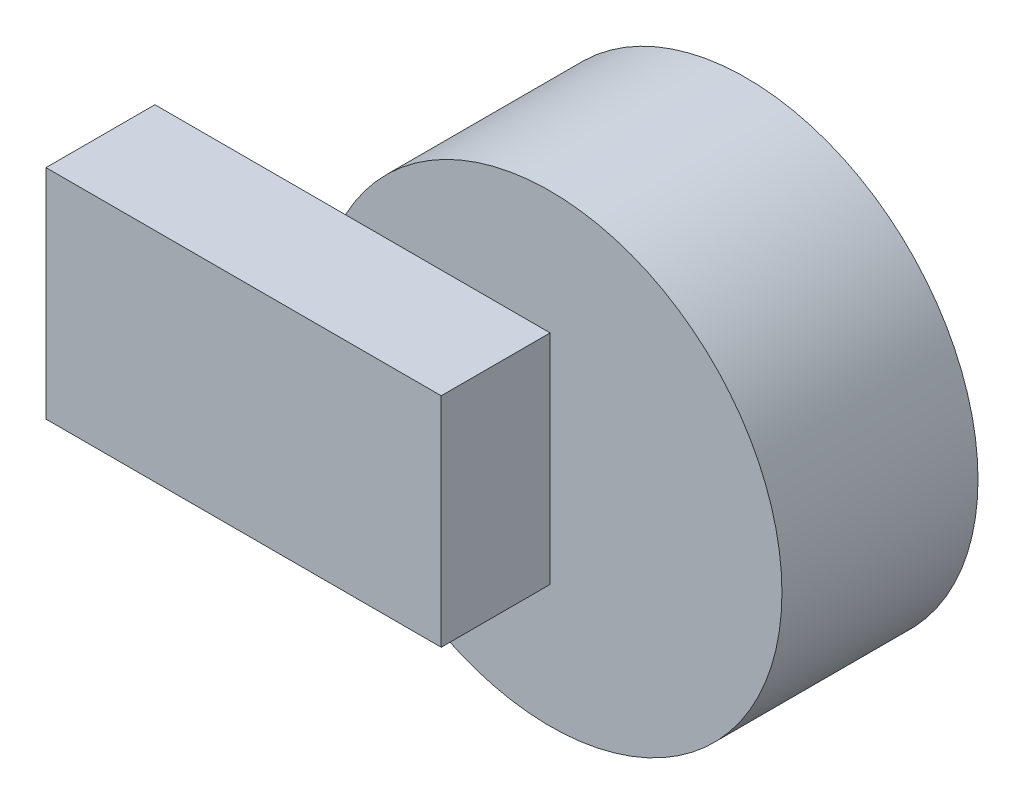
ISO-10303-21;
HEADER;
FILE_DESCRIPTION(('STEP AP214'),'2;1');
FILE_NAME('part.step','',(''),(''),'','','');
FILE_SCHEMA(('AUTOMOTIVE_DESIGN { 1 0 10303 214 1 1 1 1 }'));
ENDSEC;
DATA;
#1=APPLICATION_CONTEXT('core data for automotive mechanical design processes');
#2=APPLICATION_PROTOCOL_DEFINITION('international standard','automotive_design',2000,#1);
#3=PRODUCT_CONTEXT('',#1,'mechanical');
#4=PRODUCT('Part','Part','',(#3));
#5=PRODUCT_RELATED_PRODUCT_CATEGORY('part','',(#4));
#6=PRODUCT_DEFINITION_FORMATION('','',#4);
#7=PRODUCT_DEFINITION_CONTEXT('part definition',#1,'design');
#8=PRODUCT_DEFINITION('design','',#6,#7);
#9=PRODUCT_DEFINITION_SHAPE('','',#8);
#10=(LENGTH_UNIT() NAMED_UNIT(*) SI_UNIT(.MILLI.,.METRE.));
#11=(NAMED_UNIT(*) PLANE_ANGLE_UNIT() SI_UNIT($,.RADIAN.));
#12=(NAMED_UNIT(*) SI_UNIT($,.STERADIAN.) SOLID_ANGLE_UNIT());
#13=UNCERTAINTY_MEASURE_WITH_UNIT(LENGTH_MEASURE(1.E-05),#10,'distance_accuracy_value','');
#14=(GEOMETRIC_REPRESENTATION_CONTEXT(3) GLOBAL_UNCERTAINTY_ASSIGNED_CONTEXT((#13)) GLOBAL_UNIT_ASSIGNED_CONTEXT((#10,
#11,#12)) REPRESENTATION_CONTEXT('',''));
#15=CARTESIAN_POINT('',(0.,0.,0.));
#16=DIRECTION('',(0.,0.,1.));
#17=DIRECTION('',(1.,0.,0.));
#18=AXIS2_PLACEMENT_3D('',#15,#16,#17);
#19=CARTESIAN_POINT('',(0.,0.,36.));
#20=DIRECTION('',(0.,0.,-1.));
#21=DIRECTION('',(-1.,0.,0.));
#22=AXIS2_PLACEMENT_3D('',#19,#20,#21);
#23=CYLINDRICAL_SURFACE('',#22,42.57);
#24=CARTESIAN_POINT('',(0.,0.,36.));
#25=DIRECTION('',(0.,0.,1.));
#26=DIRECTION('',(1.,0.,0.));
#27=AXIS2_PLACEMENT_3D('',#24,#25,#26);
#28=CIRCLE('',#27,42.57);
#29=CARTESIAN_POINT('',(-37.5793147888569,20.,36.));
#30=VERTEX_POINT('',#29);
#31=CARTESIAN_POINT('',(-37.5793147888569,-20.,36.));
#32=VERTEX_POINT('',#31);
#33=EDGE_CURVE('E48',#30,#32,#28,.T.);
#34=ORIENTED_EDGE('',*,*,#33,.F.);
#35=EDGE_CURVE('E119',#32,#30,#28,.T.);
#36=ORIENTED_EDGE('',*,*,#35,.F.);
#37=EDGE_LOOP('',(#34,#36));
#38=FACE_BOUND('',#37,.T.);
#39=CARTESIAN_POINT('',(0.,0.,0.));
#40=DIRECTION('',(0.,0.,1.));
#41=DIRECTION('',(1.,0.,0.));
#42=AXIS2_PLACEMENT_3D('',#39,#40,#41);
#43=CIRCLE('',#42,42.57);
#44=CARTESIAN_POINT('',(42.57,0.,0.));
#45=VERTEX_POINT('',#44);
#46=EDGE_CURVE('E42',#45,#45,#43,.T.);
#47=ORIENTED_EDGE('',*,*,#46,.T.);
#48=EDGE_LOOP('',(#47));
#49=FACE_BOUND('',#48,.T.);
#50=ADVANCED_FACE('F39',(#38,#49),#23,.T.);
#51=CARTESIAN_POINT('',(0.,0.,36.));
#52=DIRECTION('',(0.,0.,1.));
#53=DIRECTION('',(1.,0.,0.));
#54=AXIS2_PLACEMENT_3D('',#51,#52,#53);
#55=PLANE('',#54);
#56=DIRECTION('',(-1.,0.,0.));
#57=VECTOR('',#56,1.);
#58=CARTESIAN_POINT('',(0.,20.,36.));
#59=LINE('',#58,#57);
#60=CARTESIAN_POINT('',(0.,20.,36.));
#61=VERTEX_POINT('',#60);
#62=EDGE_CURVE('E57',#61,#30,#59,.T.);
#63=ORIENTED_EDGE('',*,*,#62,.F.);
#64=DIRECTION('',(0.,-1.,0.));
#65=VECTOR('',#64,1.);
#66=CARTESIAN_POINT('',(0.,0.,36.));
#67=LINE('',#66,#65);
#68=CARTESIAN_POINT('',(0.,-20.,36.));
#69=VERTEX_POINT('',#68);
#70=EDGE_CURVE('E136',#61,#69,#67,.T.);
#71=ORIENTED_EDGE('',*,*,#70,.T.);
#72=DIRECTION('',(1.,0.,0.));
#73=VECTOR('',#72,1.);
#74=CARTESIAN_POINT('',(0.,-20.,36.));
#75=LINE('',#74,#73);
#76=EDGE_CURVE('E11',#32,#69,#75,.T.);
#77=ORIENTED_EDGE('',*,*,#76,.F.);
#78=ORIENTED_EDGE('',*,*,#35,.T.);
#79=EDGE_LOOP('',(#63,#71,#77,#78));
#80=FACE_BOUND('',#79,.T.);
#81=ADVANCED_FACE('F129',(#80),#55,.T.);
#82=CARTESIAN_POINT('',(0.,0.,0.));
#83=DIRECTION('',(0.,0.,1.));
#84=DIRECTION('',(1.,0.,0.));
#85=AXIS2_PLACEMENT_3D('',#82,#83,#84);
#86=PLANE('',#85);
#87=ORIENTED_EDGE('',*,*,#46,.F.);
#88=EDGE_LOOP('',(#87));
#89=FACE_BOUND('',#88,.T.);
#90=ADVANCED_FACE('F168',(#89),#86,.F.);
#91=CARTESIAN_POINT('',(0.,0.,36.));
#92=DIRECTION('',(0.,0.,1.));
#93=DIRECTION('',(1.,0.,0.));
#94=AXIS2_PLACEMENT_3D('',#91,#92,#93);
#95=PLANE('',#94);
#96=CARTESIAN_POINT('',(-72.57,20.,36.));
#97=VERTEX_POINT('',#96);
#98=EDGE_CURVE('E132',#30,#97,#59,.T.);
#99=ORIENTED_EDGE('',*,*,#98,.F.);
#100=ORIENTED_EDGE('',*,*,#33,.T.);
#101=CARTESIAN_POINT('',(-72.57,-20.,36.));
#102=VERTEX_POINT('',#101);
#103=EDGE_CURVE('E50',#102,#32,#75,.T.);
#104=ORIENTED_EDGE('',*,*,#103,.F.);
#105=DIRECTION('',(0.,-1.,0.));
#106=VECTOR('',#105,1.);
#107=CARTESIAN_POINT('',(-72.57,0.,36.));
#108=LINE('',#107,#106);
#109=EDGE_CURVE('E113',#97,#102,#108,.T.);
#110=ORIENTED_EDGE('',*,*,#109,.F.);
#111=EDGE_LOOP('',(#99,#100,#104,#110));
#112=FACE_BOUND('',#111,.T.);
#113=ADVANCED_FACE('F133',(#112),#95,.F.);
#114=CARTESIAN_POINT('',(-72.57,0.,56.));
#115=DIRECTION('',(1.,0.,0.));
#116=DIRECTION('',(0.,0.,-1.));
#117=AXIS2_PLACEMENT_3D('',#114,#115,#116);
#118=PLANE('',#117);
#119=ORIENTED_EDGE('',*,*,#109,.T.);
#120=DIRECTION('',(0.,0.,-1.));
#121=VECTOR('',#120,1.);
#122=CARTESIAN_POINT('',(-72.57,-20.,56.));
#123=LINE('',#122,#121);
#124=CARTESIAN_POINT('',(-72.57,-20.,56.));
#125=VERTEX_POINT('',#124);
#126=EDGE_CURVE('E91',#125,#102,#123,.T.);
#127=ORIENTED_EDGE('',*,*,#126,.F.);
#128=DIRECTION('',(0.,-1.,0.));
#129=VECTOR('',#128,1.);
#130=CARTESIAN_POINT('',(-72.57,0.,56.));
#131=LINE('',#130,#129);
#132=CARTESIAN_POINT('',(-72.57,20.,56.));
#133=VERTEX_POINT('',#132);
#134=EDGE_CURVE('E100',#133,#125,#131,.T.);
#135=ORIENTED_EDGE('',*,*,#134,.F.);
#136=DIRECTION('',(0.,0.,-1.));
#137=VECTOR('',#136,1.);
#138=CARTESIAN_POINT('',(-72.57,20.,56.));
#139=LINE('',#138,#137);
#140=EDGE_CURVE('E143',#133,#97,#139,.T.);
#141=ORIENTED_EDGE('',*,*,#140,.T.);
#142=EDGE_LOOP('',(#119,#127,#135,#141));
#143=FACE_BOUND('',#142,.T.);
#144=ADVANCED_FACE('F111',(#143),#118,.F.);
#145=CARTESIAN_POINT('',(0.,-20.,56.));
#146=DIRECTION('',(0.,1.,0.));
#147=DIRECTION('',(-1.,0.,0.));
#148=AXIS2_PLACEMENT_3D('',#145,#146,#147);
#149=PLANE('',#148);
#150=ORIENTED_EDGE('',*,*,#103,.T.);
#151=ORIENTED_EDGE('',*,*,#76,.T.);
#152=DIRECTION('',(0.,0.,-1.));
#153=VECTOR('',#152,1.);
#154=CARTESIAN_POINT('',(0.,-20.,56.));
#155=LINE('',#154,#153);
#156=CARTESIAN_POINT('',(0.,-20.,56.));
#157=VERTEX_POINT('',#156);
#158=EDGE_CURVE('E94',#157,#69,#155,.T.);
#159=ORIENTED_EDGE('',*,*,#158,.F.);
#160=DIRECTION('',(1.,0.,0.));
#161=VECTOR('',#160,1.);
#162=CARTESIAN_POINT('',(0.,-20.,56.));
#163=LINE('',#162,#161);
#164=EDGE_CURVE('E86',#125,#157,#163,.T.);
#165=ORIENTED_EDGE('',*,*,#164,.F.);
#166=ORIENTED_EDGE('',*,*,#126,.T.);
#167=EDGE_LOOP('',(#150,#151,#159,#165,#166));
#168=FACE_BOUND('',#167,.T.);
#169=ADVANCED_FACE('F89',(#168),#149,.F.);
#170=CARTESIAN_POINT('',(0.,0.,56.));
#171=DIRECTION('',(1.,0.,0.));
#172=DIRECTION('',(0.,1.,0.));
#173=AXIS2_PLACEMENT_3D('',#170,#171,#172);
#174=PLANE('',#173);
#175=ORIENTED_EDGE('',*,*,#70,.F.);
#176=DIRECTION('',(0.,0.,-1.));
#177=VECTOR('',#176,1.);
#178=CARTESIAN_POINT('',(0.,20.,56.));
#179=LINE('',#178,#177);
#180=CARTESIAN_POINT('',(0.,20.,56.));
#181=VERTEX_POINT('',#180);
#182=EDGE_CURVE('E120',#181,#61,#179,.T.);
#183=ORIENTED_EDGE('',*,*,#182,.F.);
#184=DIRECTION('',(0.,-1.,0.));
#185=VECTOR('',#184,1.);
#186=CARTESIAN_POINT('',(0.,0.,56.));
#187=LINE('',#186,#185);
#188=EDGE_CURVE('E99',#181,#157,#187,.T.);
#189=ORIENTED_EDGE('',*,*,#188,.T.);
#190=ORIENTED_EDGE('',*,*,#158,.T.);
#191=EDGE_LOOP('',(#175,#183,#189,#190));
#192=FACE_BOUND('',#191,.T.);
#193=ADVANCED_FACE('F155',(#192),#174,.T.);
#194=CARTESIAN_POINT('',(0.,20.,56.));
#195=DIRECTION('',(0.,-1.,0.));
#196=DIRECTION('',(1.,0.,0.));
#197=AXIS2_PLACEMENT_3D('',#194,#195,#196);
#198=PLANE('',#197);
#199=ORIENTED_EDGE('',*,*,#62,.T.);
#200=ORIENTED_EDGE('',*,*,#98,.T.);
#201=ORIENTED_EDGE('',*,*,#140,.F.);
#202=DIRECTION('',(-1.,0.,0.));
#203=VECTOR('',#202,1.);
#204=CARTESIAN_POINT('',(0.,20.,56.));
#205=LINE('',#204,#203);
#206=EDGE_CURVE('E105',#181,#133,#205,.T.);
#207=ORIENTED_EDGE('',*,*,#206,.F.);
#208=ORIENTED_EDGE('',*,*,#182,.T.);
#209=EDGE_LOOP('',(#199,#200,#201,#207,#208));
#210=FACE_BOUND('',#209,.T.);
#211=ADVANCED_FACE('F138',(#210),#198,.F.);
#212=CARTESIAN_POINT('',(0.,0.,56.));
#213=DIRECTION('',(0.,0.,1.));
#214=DIRECTION('',(1.,0.,0.));
#215=AXIS2_PLACEMENT_3D('',#212,#213,#214);
#216=PLANE('',#215);
#217=ORIENTED_EDGE('',*,*,#134,.T.);
#218=ORIENTED_EDGE('',*,*,#164,.T.);
#219=ORIENTED_EDGE('',*,*,#188,.F.);
#220=ORIENTED_EDGE('',*,*,#206,.T.);
#221=EDGE_LOOP('',(#217,#218,#219,#220));
#222=FACE_BOUND('',#221,.T.);
#223=ADVANCED_FACE('F103',(#222),#216,.T.);
#224=CLOSED_SHELL('',(#50,#81,#90,#113,#144,#169,#193,#211,#223));
#225=MANIFOLD_SOLID_BREP('B2',#224);
#226=ADVANCED_BREP_SHAPE_REPRESENTATION('',(#18,#225),#14);
#227=SHAPE_DEFINITION_REPRESENTATION(#9,#226);
ENDSEC;
END-ISO-10303-21;
